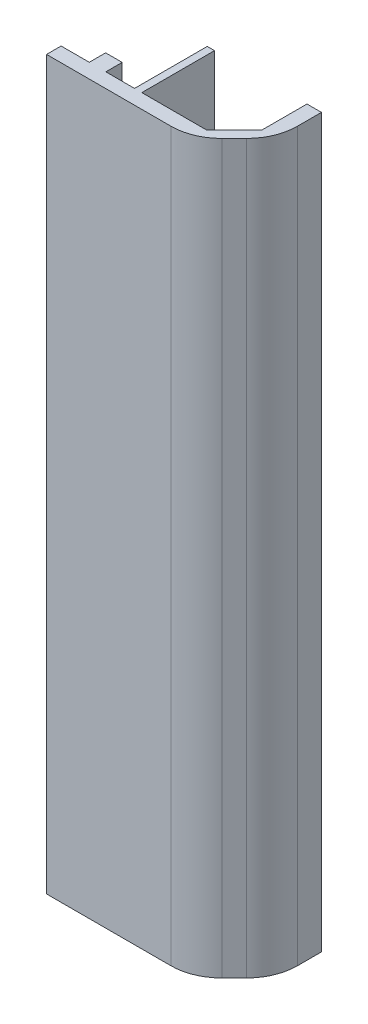
ISO-10303-21;
HEADER;
FILE_DESCRIPTION(('STEP AP214'),'2;1');
FILE_NAME('part.step','',(''),(''),'','','');
FILE_SCHEMA(('AUTOMOTIVE_DESIGN { 1 0 10303 214 1 1 1 1 }'));
ENDSEC;
DATA;
#1=APPLICATION_CONTEXT('core data for automotive mechanical design processes');
#2=APPLICATION_PROTOCOL_DEFINITION('international standard','automotive_design',2000,#1);
#3=PRODUCT_CONTEXT('',#1,'mechanical');
#4=PRODUCT('Part','Part','',(#3));
#5=PRODUCT_RELATED_PRODUCT_CATEGORY('part','',(#4));
#6=PRODUCT_DEFINITION_FORMATION('','',#4);
#7=PRODUCT_DEFINITION_CONTEXT('part definition',#1,'design');
#8=PRODUCT_DEFINITION('design','',#6,#7);
#9=PRODUCT_DEFINITION_SHAPE('','',#8);
#10=(LENGTH_UNIT() NAMED_UNIT(*) SI_UNIT(.MILLI.,.METRE.));
#11=(NAMED_UNIT(*) PLANE_ANGLE_UNIT() SI_UNIT($,.RADIAN.));
#12=(NAMED_UNIT(*) SI_UNIT($,.STERADIAN.) SOLID_ANGLE_UNIT());
#13=UNCERTAINTY_MEASURE_WITH_UNIT(LENGTH_MEASURE(1.E-05),#10,'distance_accuracy_value','');
#14=(GEOMETRIC_REPRESENTATION_CONTEXT(3) GLOBAL_UNCERTAINTY_ASSIGNED_CONTEXT((#13)) GLOBAL_UNIT_ASSIGNED_CONTEXT((#10,
#11,#12)) REPRESENTATION_CONTEXT('',''));
#15=CARTESIAN_POINT('',(0.,0.,0.));
#16=DIRECTION('',(0.,0.,1.));
#17=DIRECTION('',(1.,0.,0.));
#18=AXIS2_PLACEMENT_3D('',#15,#16,#17);
#19=CARTESIAN_POINT('',(-22.9517231924407,200.,-2.35925925925926));
#20=DIRECTION('',(0.,0.,1.));
#21=DIRECTION('',(1.,0.,0.));
#22=AXIS2_PLACEMENT_3D('',#19,#20,#21);
#23=PLANE('',#22);
#24=DIRECTION('',(0.,-1.,0.));
#25=VECTOR('',#24,1.);
#26=CARTESIAN_POINT('',(-13.0517231924407,200.,-2.35925925925926));
#27=LINE('',#26,#25);
#28=CARTESIAN_POINT('',(-13.0517231924407,200.,-2.35925925925926));
#29=VERTEX_POINT('',#28);
#30=CARTESIAN_POINT('',(-13.0517231924407,0.,-2.35925925925926));
#31=VERTEX_POINT('',#30);
#32=EDGE_CURVE('E61',#29,#31,#27,.T.);
#33=ORIENTED_EDGE('',*,*,#32,.F.);
#34=DIRECTION('',(-1.,0.,0.));
#35=VECTOR('',#34,1.);
#36=CARTESIAN_POINT('',(-22.9517231924407,200.,-2.35925925925926));
#37=LINE('',#36,#35);
#38=CARTESIAN_POINT('',(4.79827680755932,200.,-2.35925925925926));
#39=VERTEX_POINT('',#38);
#40=EDGE_CURVE('E234',#39,#29,#37,.T.);
#41=ORIENTED_EDGE('',*,*,#40,.F.);
#42=DIRECTION('',(0.,-1.,0.));
#43=VECTOR('',#42,1.);
#44=CARTESIAN_POINT('',(4.79827680755932,200.,-2.35925925925926));
#45=LINE('',#44,#43);
#46=CARTESIAN_POINT('',(4.79827680755932,0.,-2.35925925925926));
#47=VERTEX_POINT('',#46);
#48=EDGE_CURVE('E289',#39,#47,#45,.T.);
#49=ORIENTED_EDGE('',*,*,#48,.T.);
#50=DIRECTION('',(-1.,0.,0.));
#51=VECTOR('',#50,1.);
#52=CARTESIAN_POINT('',(-22.9517231924407,0.,-2.35925925925926));
#53=LINE('',#52,#51);
#54=EDGE_CURVE('E270',#47,#31,#53,.T.);
#55=ORIENTED_EDGE('',*,*,#54,.T.);
#56=EDGE_LOOP('',(#33,#41,#49,#55));
#57=FACE_BOUND('',#56,.T.);
#58=ADVANCED_FACE('F37',(#57),#23,.F.);
#59=DIRECTION('',(0.,1.,0.));
#60=VECTOR('',#59,1.);
#61=CARTESIAN_POINT('',(-15.0517231924407,200.,-2.35925925925926));
#62=LINE('',#61,#60);
#63=CARTESIAN_POINT('',(-15.0517231924407,0.,-2.35925925925926));
#64=VERTEX_POINT('',#63);
#65=CARTESIAN_POINT('',(-15.0517231924407,200.,-2.35925925925926));
#66=VERTEX_POINT('',#65);
#67=EDGE_CURVE('E188',#64,#66,#62,.T.);
#68=ORIENTED_EDGE('',*,*,#67,.F.);
#69=CARTESIAN_POINT('',(-22.9517231924407,0.,-2.35925925925926));
#70=VERTEX_POINT('',#69);
#71=EDGE_CURVE('E269',#64,#70,#53,.T.);
#72=ORIENTED_EDGE('',*,*,#71,.T.);
#73=DIRECTION('',(0.,-1.,0.));
#74=VECTOR('',#73,1.);
#75=CARTESIAN_POINT('',(-22.9517231924407,200.,-2.35925925925926));
#76=LINE('',#75,#74);
#77=CARTESIAN_POINT('',(-22.9517231924407,200.,-2.35925925925926));
#78=VERTEX_POINT('',#77);
#79=EDGE_CURVE('E285',#78,#70,#76,.T.);
#80=ORIENTED_EDGE('',*,*,#79,.F.);
#81=EDGE_CURVE('E53',#66,#78,#37,.T.);
#82=ORIENTED_EDGE('',*,*,#81,.F.);
#83=EDGE_LOOP('',(#68,#72,#80,#82));
#84=FACE_BOUND('',#83,.T.);
#85=ADVANCED_FACE('F375',(#84),#23,.F.);
#86=CARTESIAN_POINT('',(-27.5017231924407,200.,-6.85925925925926));
#87=DIRECTION('',(1.,0.,0.));
#88=DIRECTION('',(0.,0.,-1.));
#89=AXIS2_PLACEMENT_3D('',#86,#87,#88);
#90=PLANE('',#89);
#91=DIRECTION('',(0.,0.,1.));
#92=VECTOR('',#91,1.);
#93=CARTESIAN_POINT('',(-27.5017231924407,0.,-6.85925925925926));
#94=LINE('',#93,#92);
#95=CARTESIAN_POINT('',(-27.5017231924407,0.,-6.85925925925926));
#96=VERTEX_POINT('',#95);
#97=CARTESIAN_POINT('',(-27.5017231924407,0.,-2.35925925925926));
#98=VERTEX_POINT('',#97);
#99=EDGE_CURVE('E192',#96,#98,#94,.T.);
#100=ORIENTED_EDGE('',*,*,#99,.T.);
#101=DIRECTION('',(0.,-1.,0.));
#102=VECTOR('',#101,1.);
#103=CARTESIAN_POINT('',(-27.5017231924407,200.,-2.35925925925926));
#104=LINE('',#103,#102);
#105=CARTESIAN_POINT('',(-27.5017231924407,200.,-2.35925925925926));
#106=VERTEX_POINT('',#105);
#107=EDGE_CURVE('E313',#106,#98,#104,.T.);
#108=ORIENTED_EDGE('',*,*,#107,.F.);
#109=DIRECTION('',(0.,0.,1.));
#110=VECTOR('',#109,1.);
#111=CARTESIAN_POINT('',(-27.5017231924407,200.,-6.85925925925926));
#112=LINE('',#111,#110);
#113=CARTESIAN_POINT('',(-27.5017231924407,200.,-6.85925925925926));
#114=VERTEX_POINT('',#113);
#115=EDGE_CURVE('E203',#114,#106,#112,.T.);
#116=ORIENTED_EDGE('',*,*,#115,.F.);
#117=DIRECTION('',(0.,-1.,0.));
#118=VECTOR('',#117,1.);
#119=CARTESIAN_POINT('',(-27.5017231924407,200.,-6.85925925925926));
#120=LINE('',#119,#118);
#121=EDGE_CURVE('E242',#114,#96,#120,.T.);
#122=ORIENTED_EDGE('',*,*,#121,.T.);
#123=EDGE_LOOP('',(#100,#108,#116,#122));
#124=FACE_BOUND('',#123,.T.);
#125=ADVANCED_FACE('F365',(#124),#90,.F.);
#126=CARTESIAN_POINT('',(-27.5017231924407,200.,-2.35925925925926));
#127=DIRECTION('',(0.,0.,1.));
#128=DIRECTION('',(1.,0.,0.));
#129=AXIS2_PLACEMENT_3D('',#126,#127,#128);
#130=PLANE('',#129);
#131=DIRECTION('',(-1.,0.,0.));
#132=VECTOR('',#131,1.);
#133=CARTESIAN_POINT('',(-27.5017231924407,0.,-2.35925925925926));
#134=LINE('',#133,#132);
#135=CARTESIAN_POINT('',(-35.2517231924407,0.,-2.35925925925926));
#136=VERTEX_POINT('',#135);
#137=EDGE_CURVE('E197',#98,#136,#134,.T.);
#138=ORIENTED_EDGE('',*,*,#137,.T.);
#139=DIRECTION('',(0.,-1.,0.));
#140=VECTOR('',#139,1.);
#141=CARTESIAN_POINT('',(-35.2517231924407,200.,-2.35925925925926));
#142=LINE('',#141,#140);
#143=CARTESIAN_POINT('',(-35.2517231924407,200.,-2.35925925925926));
#144=VERTEX_POINT('',#143);
#145=EDGE_CURVE('E309',#144,#136,#142,.T.);
#146=ORIENTED_EDGE('',*,*,#145,.F.);
#147=DIRECTION('',(-1.,0.,0.));
#148=VECTOR('',#147,1.);
#149=CARTESIAN_POINT('',(-27.5017231924407,200.,-2.35925925925926));
#150=LINE('',#149,#148);
#151=EDGE_CURVE('E207',#106,#144,#150,.T.);
#152=ORIENTED_EDGE('',*,*,#151,.F.);
#153=ORIENTED_EDGE('',*,*,#107,.T.);
#154=EDGE_LOOP('',(#138,#146,#152,#153));
#155=FACE_BOUND('',#154,.T.);
#156=ADVANCED_FACE('F362',(#155),#130,.F.);
#157=CARTESIAN_POINT('',(-35.2517231924407,200.,-2.35925925925926));
#158=DIRECTION('',(1.,0.,0.));
#159=DIRECTION('',(0.,0.,-1.));
#160=AXIS2_PLACEMENT_3D('',#157,#158,#159);
#161=PLANE('',#160);
#162=DIRECTION('',(0.,0.,1.));
#163=VECTOR('',#162,1.);
#164=CARTESIAN_POINT('',(-35.2517231924407,0.,-2.35925925925926));
#165=LINE('',#164,#163);
#166=CARTESIAN_POINT('',(-35.2517231924407,0.,1.64074074074074));
#167=VERTEX_POINT('',#166);
#168=EDGE_CURVE('E246',#136,#167,#165,.T.);
#169=ORIENTED_EDGE('',*,*,#168,.T.);
#170=DIRECTION('',(0.,-1.,0.));
#171=VECTOR('',#170,1.);
#172=CARTESIAN_POINT('',(-35.2517231924407,200.,1.64074074074074));
#173=LINE('',#172,#171);
#174=CARTESIAN_POINT('',(-35.2517231924407,200.,1.64074074074074));
#175=VERTEX_POINT('',#174);
#176=EDGE_CURVE('E305',#175,#167,#173,.T.);
#177=ORIENTED_EDGE('',*,*,#176,.F.);
#178=DIRECTION('',(0.,0.,1.));
#179=VECTOR('',#178,1.);
#180=CARTESIAN_POINT('',(-35.2517231924407,200.,-2.35925925925926));
#181=LINE('',#180,#179);
#182=EDGE_CURVE('E211',#144,#175,#181,.T.);
#183=ORIENTED_EDGE('',*,*,#182,.F.);
#184=ORIENTED_EDGE('',*,*,#145,.T.);
#185=EDGE_LOOP('',(#169,#177,#183,#184));
#186=FACE_BOUND('',#185,.T.);
#187=ADVANCED_FACE('F356',(#186),#161,.F.);
#188=CARTESIAN_POINT('',(-35.2517231924407,200.,1.64074074074074));
#189=DIRECTION('',(0.,0.,-1.));
#190=DIRECTION('',(-1.,0.,0.));
#191=AXIS2_PLACEMENT_3D('',#188,#189,#190);
#192=PLANE('',#191);
#193=DIRECTION('',(1.,0.,0.));
#194=VECTOR('',#193,1.);
#195=CARTESIAN_POINT('',(-35.2517231924407,0.,1.64074074074074));
#196=LINE('',#195,#194);
#197=CARTESIAN_POINT('',(-1.02071306566402,0.,1.64074074074074));
#198=VERTEX_POINT('',#197);
#199=EDGE_CURVE('E249',#167,#198,#196,.T.);
#200=ORIENTED_EDGE('',*,*,#199,.T.);
#201=DIRECTION('',(0.,-1.,0.));
#202=VECTOR('',#201,1.);
#203=CARTESIAN_POINT('',(-1.02071306566402,200.,1.64074074074074));
#204=LINE('',#203,#202);
#205=CARTESIAN_POINT('',(-1.02071306566402,200.,1.64074074074074));
#206=VERTEX_POINT('',#205);
#207=EDGE_CURVE('E330',#198,#206,#204,.F.);
#208=ORIENTED_EDGE('',*,*,#207,.T.);
#209=DIRECTION('',(1.,0.,0.));
#210=VECTOR('',#209,1.);
#211=CARTESIAN_POINT('',(-35.2517231924407,200.,1.64074074074074));
#212=LINE('',#211,#210);
#213=EDGE_CURVE('E214',#175,#206,#212,.T.);
#214=ORIENTED_EDGE('',*,*,#213,.F.);
#215=ORIENTED_EDGE('',*,*,#176,.T.);
#216=EDGE_LOOP('',(#200,#208,#214,#215));
#217=FACE_BOUND('',#216,.T.);
#218=ADVANCED_FACE('F352',(#217),#192,.F.);
#219=CARTESIAN_POINT('',(4.77827680755932,200.,1.64074074074074));
#220=DIRECTION('',(-0.707106781186547,0.,-0.707106781186548));
#221=DIRECTION('',(-0.707106781186548,0.,0.707106781186547));
#222=AXIS2_PLACEMENT_3D('',#219,#220,#221);
#223=PLANE('',#222);
#224=DIRECTION('',(0.707106781186548,0.,-0.707106781186547));
#225=VECTOR('',#224,1.);
#226=CARTESIAN_POINT('',(4.77827680755932,200.,1.64074074074074));
#227=LINE('',#226,#225);
#228=CARTESIAN_POINT('',(8.87878187094765,200.,-2.45976432264759));
#229=VERTEX_POINT('',#228);
#230=CARTESIAN_POINT('',(12.2611050775043,200.,-5.84208752920422));
#231=VERTEX_POINT('',#230);
#232=EDGE_CURVE('E218',#229,#231,#227,.T.);
#233=ORIENTED_EDGE('',*,*,#232,.F.);
#234=DIRECTION('',(0.,-1.,0.));
#235=VECTOR('',#234,1.);
#236=CARTESIAN_POINT('',(8.87878187094765,200.,-2.45976432264759));
#237=LINE('',#236,#235);
#238=CARTESIAN_POINT('',(8.87878187094765,0.,-2.45976432264759));
#239=VERTEX_POINT('',#238);
#240=EDGE_CURVE('E320',#229,#239,#237,.T.);
#241=ORIENTED_EDGE('',*,*,#240,.T.);
#242=DIRECTION('',(0.707106781186548,0.,-0.707106781186547));
#243=VECTOR('',#242,1.);
#244=CARTESIAN_POINT('',(4.77827680755932,0.,1.64074074074074));
#245=LINE('',#244,#243);
#246=CARTESIAN_POINT('',(12.2611050775043,0.,-5.84208752920422));
#247=VERTEX_POINT('',#246);
#248=EDGE_CURVE('E253',#239,#247,#245,.T.);
#249=ORIENTED_EDGE('',*,*,#248,.T.);
#250=DIRECTION('',(0.,-1.,0.));
#251=VECTOR('',#250,1.);
#252=CARTESIAN_POINT('',(12.2611050775043,200.,-5.84208752920422));
#253=LINE('',#252,#251);
#254=EDGE_CURVE('E317',#247,#231,#253,.F.);
#255=ORIENTED_EDGE('',*,*,#254,.T.);
#256=EDGE_LOOP('',(#233,#241,#249,#255));
#257=FACE_BOUND('',#256,.T.);
#258=ADVANCED_FACE('F346',(#257),#223,.F.);
#259=CARTESIAN_POINT('',(16.3616101408926,200.,-22.3592592592593));
#260=DIRECTION('',(-1.,0.,0.));
#261=DIRECTION('',(0.,0.,1.));
#262=AXIS2_PLACEMENT_3D('',#259,#260,#261);
#263=PLANE('',#262);
#264=DIRECTION('',(0.,0.,-1.));
#265=VECTOR('',#264,1.);
#266=CARTESIAN_POINT('',(16.3616101408926,200.,-22.3592592592593));
#267=LINE('',#266,#265);
#268=CARTESIAN_POINT('',(16.3616101408926,200.,-15.7415824658159));
#269=VERTEX_POINT('',#268);
#270=CARTESIAN_POINT('',(16.3616101408926,200.,-22.3592592592593));
#271=VERTEX_POINT('',#270);
#272=EDGE_CURVE('E222',#269,#271,#267,.T.);
#273=ORIENTED_EDGE('',*,*,#272,.F.);
#274=DIRECTION('',(0.,-1.,0.));
#275=VECTOR('',#274,1.);
#276=CARTESIAN_POINT('',(16.3616101408926,200.,-15.7415824658159));
#277=LINE('',#276,#275);
#278=CARTESIAN_POINT('',(16.3616101408926,0.,-15.7415824658159));
#279=VERTEX_POINT('',#278);
#280=EDGE_CURVE('E11',#269,#279,#277,.T.);
#281=ORIENTED_EDGE('',*,*,#280,.T.);
#282=DIRECTION('',(0.,0.,-1.));
#283=VECTOR('',#282,1.);
#284=CARTESIAN_POINT('',(16.3616101408926,0.,-22.3592592592593));
#285=LINE('',#284,#283);
#286=CARTESIAN_POINT('',(16.3616101408926,0.,-22.3592592592593));
#287=VERTEX_POINT('',#286);
#288=EDGE_CURVE('E257',#279,#287,#285,.T.);
#289=ORIENTED_EDGE('',*,*,#288,.T.);
#290=DIRECTION('',(0.,-1.,0.));
#291=VECTOR('',#290,1.);
#292=CARTESIAN_POINT('',(16.3616101408926,200.,-22.3592592592593));
#293=LINE('',#292,#291);
#294=EDGE_CURVE('E301',#271,#287,#293,.T.);
#295=ORIENTED_EDGE('',*,*,#294,.F.);
#296=EDGE_LOOP('',(#273,#281,#289,#295));
#297=FACE_BOUND('',#296,.T.);
#298=ADVANCED_FACE('F421',(#297),#263,.F.);
#299=CARTESIAN_POINT('',(12.3816101408926,200.,-22.3592592592593));
#300=DIRECTION('',(0.,0.,1.));
#301=DIRECTION('',(1.,0.,0.));
#302=AXIS2_PLACEMENT_3D('',#299,#300,#301);
#303=PLANE('',#302);
#304=DIRECTION('',(-1.,0.,0.));
#305=VECTOR('',#304,1.);
#306=CARTESIAN_POINT('',(12.3816101408926,0.,-22.3592592592593));
#307=LINE('',#306,#305);
#308=CARTESIAN_POINT('',(12.3816101408926,0.,-22.3592592592593));
#309=VERTEX_POINT('',#308);
#310=EDGE_CURVE('E260',#287,#309,#307,.T.);
#311=ORIENTED_EDGE('',*,*,#310,.T.);
#312=DIRECTION('',(0.,-1.,0.));
#313=VECTOR('',#312,1.);
#314=CARTESIAN_POINT('',(12.3816101408926,200.,-22.3592592592593));
#315=LINE('',#314,#313);
#316=CARTESIAN_POINT('',(12.3816101408926,200.,-22.3592592592593));
#317=VERTEX_POINT('',#316);
#318=EDGE_CURVE('E297',#317,#309,#315,.T.);
#319=ORIENTED_EDGE('',*,*,#318,.F.);
#320=DIRECTION('',(-1.,0.,0.));
#321=VECTOR('',#320,1.);
#322=CARTESIAN_POINT('',(12.3816101408926,200.,-22.3592592592593));
#323=LINE('',#322,#321);
#324=EDGE_CURVE('E225',#271,#317,#323,.T.);
#325=ORIENTED_EDGE('',*,*,#324,.F.);
#326=ORIENTED_EDGE('',*,*,#294,.T.);
#327=EDGE_LOOP('',(#311,#319,#325,#326));
#328=FACE_BOUND('',#327,.T.);
#329=ADVANCED_FACE('F417',(#328),#303,.F.);
#330=CARTESIAN_POINT('',(12.3816101408926,200.,-9.94259259259255));
#331=DIRECTION('',(1.,0.,0.));
#332=DIRECTION('',(0.,0.,-1.));
#333=AXIS2_PLACEMENT_3D('',#330,#331,#332);
#334=PLANE('',#333);
#335=DIRECTION('',(0.,0.,1.));
#336=VECTOR('',#335,1.);
#337=CARTESIAN_POINT('',(12.3816101408926,0.,-9.94259259259255));
#338=LINE('',#337,#336);
#339=CARTESIAN_POINT('',(12.3816101408926,0.,-9.94259259259255));
#340=VERTEX_POINT('',#339);
#341=EDGE_CURVE('E263',#309,#340,#338,.T.);
#342=ORIENTED_EDGE('',*,*,#341,.T.);
#343=DIRECTION('',(0.,-1.,0.));
#344=VECTOR('',#343,1.);
#345=CARTESIAN_POINT('',(12.3816101408926,200.,-9.94259259259255));
#346=LINE('',#345,#344);
#347=CARTESIAN_POINT('',(12.3816101408926,200.,-9.94259259259255));
#348=VERTEX_POINT('',#347);
#349=EDGE_CURVE('E293',#348,#340,#346,.T.);
#350=ORIENTED_EDGE('',*,*,#349,.F.);
#351=DIRECTION('',(0.,0.,1.));
#352=VECTOR('',#351,1.);
#353=CARTESIAN_POINT('',(12.3816101408926,200.,-9.94259259259255));
#354=LINE('',#353,#352);
#355=EDGE_CURVE('E228',#317,#348,#354,.T.);
#356=ORIENTED_EDGE('',*,*,#355,.F.);
#357=ORIENTED_EDGE('',*,*,#318,.T.);
#358=EDGE_LOOP('',(#342,#350,#356,#357));
#359=FACE_BOUND('',#358,.T.);
#360=ADVANCED_FACE('F413',(#359),#334,.F.);
#361=CARTESIAN_POINT('',(4.79827680755932,200.,-2.35925925925926));
#362=DIRECTION('',(0.707106781186548,0.,0.707106781186547));
#363=DIRECTION('',(0.707106781186547,0.,-0.707106781186548));
#364=AXIS2_PLACEMENT_3D('',#361,#362,#363);
#365=PLANE('',#364);
#366=DIRECTION('',(-0.707106781186547,0.,0.707106781186548));
#367=VECTOR('',#366,1.);
#368=CARTESIAN_POINT('',(4.79827680755932,0.,-2.35925925925926));
#369=LINE('',#368,#367);
#370=EDGE_CURVE('E266',#340,#47,#369,.T.);
#371=ORIENTED_EDGE('',*,*,#370,.T.);
#372=ORIENTED_EDGE('',*,*,#48,.F.);
#373=DIRECTION('',(-0.707106781186547,0.,0.707106781186548));
#374=VECTOR('',#373,1.);
#375=CARTESIAN_POINT('',(4.79827680755932,200.,-2.35925925925926));
#376=LINE('',#375,#374);
#377=EDGE_CURVE('E231',#348,#39,#376,.T.);
#378=ORIENTED_EDGE('',*,*,#377,.F.);
#379=ORIENTED_EDGE('',*,*,#349,.T.);
#380=EDGE_LOOP('',(#371,#372,#378,#379));
#381=FACE_BOUND('',#380,.T.);
#382=ADVANCED_FACE('F410',(#381),#365,.F.);
#383=CARTESIAN_POINT('',(-22.9517231924407,200.,-6.85925925925926));
#384=DIRECTION('',(-1.,0.,0.));
#385=DIRECTION('',(0.,0.,1.));
#386=AXIS2_PLACEMENT_3D('',#383,#384,#385);
#387=PLANE('',#386);
#388=DIRECTION('',(0.,0.,-1.));
#389=VECTOR('',#388,1.);
#390=CARTESIAN_POINT('',(-22.9517231924407,0.,-6.85925925925926));
#391=LINE('',#390,#389);
#392=CARTESIAN_POINT('',(-22.9517231924407,0.,-6.85925925925926));
#393=VERTEX_POINT('',#392);
#394=EDGE_CURVE('E273',#70,#393,#391,.T.);
#395=ORIENTED_EDGE('',*,*,#394,.T.);
#396=DIRECTION('',(0.,-1.,0.));
#397=VECTOR('',#396,1.);
#398=CARTESIAN_POINT('',(-22.9517231924407,200.,-6.85925925925926));
#399=LINE('',#398,#397);
#400=CARTESIAN_POINT('',(-22.9517231924407,200.,-6.85925925925926));
#401=VERTEX_POINT('',#400);
#402=EDGE_CURVE('E281',#401,#393,#399,.T.);
#403=ORIENTED_EDGE('',*,*,#402,.F.);
#404=DIRECTION('',(0.,0.,-1.));
#405=VECTOR('',#404,1.);
#406=CARTESIAN_POINT('',(-22.9517231924407,200.,-6.85925925925926));
#407=LINE('',#406,#405);
#408=EDGE_CURVE('E237',#78,#401,#407,.T.);
#409=ORIENTED_EDGE('',*,*,#408,.F.);
#410=ORIENTED_EDGE('',*,*,#79,.T.);
#411=EDGE_LOOP('',(#395,#403,#409,#410));
#412=FACE_BOUND('',#411,.T.);
#413=ADVANCED_FACE('F373',(#412),#387,.F.);
#414=CARTESIAN_POINT('',(-27.5017231924407,200.,-6.85925925925926));
#415=DIRECTION('',(0.,0.,1.));
#416=DIRECTION('',(1.,0.,0.));
#417=AXIS2_PLACEMENT_3D('',#414,#415,#416);
#418=PLANE('',#417);
#419=DIRECTION('',(-1.,0.,0.));
#420=VECTOR('',#419,1.);
#421=CARTESIAN_POINT('',(-27.5017231924407,0.,-6.85925925925926));
#422=LINE('',#421,#420);
#423=EDGE_CURVE('E208',#393,#96,#422,.T.);
#424=ORIENTED_EDGE('',*,*,#423,.T.);
#425=ORIENTED_EDGE('',*,*,#121,.F.);
#426=DIRECTION('',(-1.,0.,0.));
#427=VECTOR('',#426,1.);
#428=CARTESIAN_POINT('',(-27.5017231924407,200.,-6.85925925925926));
#429=LINE('',#428,#427);
#430=EDGE_CURVE('E240',#401,#114,#429,.T.);
#431=ORIENTED_EDGE('',*,*,#430,.F.);
#432=ORIENTED_EDGE('',*,*,#402,.T.);
#433=EDGE_LOOP('',(#424,#425,#431,#432));
#434=FACE_BOUND('',#433,.T.);
#435=ADVANCED_FACE('F369',(#434),#418,.F.);
#436=CARTESIAN_POINT('',(0.,200.,0.));
#437=DIRECTION('',(0.,-1.,0.));
#438=DIRECTION('',(0.,0.,-1.));
#439=AXIS2_PLACEMENT_3D('',#436,#437,#438);
#440=PLANE('',#439);
#441=ORIENTED_EDGE('',*,*,#213,.T.);
#442=CARTESIAN_POINT('',(-1.02071306566402,200.,-12.3592592592593));
#443=DIRECTION('',(0.,-1.,0.));
#444=DIRECTION('',(0.,0.,-1.));
#445=AXIS2_PLACEMENT_3D('',#442,#443,#444);
#446=CIRCLE('',#445,14.);
#447=EDGE_CURVE('E46',#206,#229,#446,.F.);
#448=ORIENTED_EDGE('',*,*,#447,.T.);
#449=ORIENTED_EDGE('',*,*,#232,.T.);
#450=CARTESIAN_POINT('',(2.36161014089262,200.,-15.7415824658159));
#451=DIRECTION('',(0.,-1.,0.));
#452=DIRECTION('',(0.,0.,-1.));
#453=AXIS2_PLACEMENT_3D('',#450,#451,#452);
#454=CIRCLE('',#453,14.);
#455=EDGE_CURVE('E333',#231,#269,#454,.F.);
#456=ORIENTED_EDGE('',*,*,#455,.T.);
#457=ORIENTED_EDGE('',*,*,#272,.T.);
#458=ORIENTED_EDGE('',*,*,#324,.T.);
#459=ORIENTED_EDGE('',*,*,#355,.T.);
#460=ORIENTED_EDGE('',*,*,#377,.T.);
#461=ORIENTED_EDGE('',*,*,#40,.T.);
#462=DIRECTION('',(0.,0.,1.));
#463=VECTOR('',#462,1.);
#464=CARTESIAN_POINT('',(-13.0517231924407,200.,-22.3592592592593));
#465=LINE('',#464,#463);
#466=CARTESIAN_POINT('',(-13.0517231924407,200.,-22.3592592592593));
#467=VERTEX_POINT('',#466);
#468=EDGE_CURVE('E382',#467,#29,#465,.T.);
#469=ORIENTED_EDGE('',*,*,#468,.F.);
#470=DIRECTION('',(1.,0.,0.));
#471=VECTOR('',#470,1.);
#472=CARTESIAN_POINT('',(-13.0517231924407,200.,-22.3592592592593));
#473=LINE('',#472,#471);
#474=CARTESIAN_POINT('',(-15.0517231924407,200.,-22.3592592592593));
#475=VERTEX_POINT('',#474);
#476=EDGE_CURVE('E183',#475,#467,#473,.T.);
#477=ORIENTED_EDGE('',*,*,#476,.F.);
#478=DIRECTION('',(0.,0.,1.));
#479=VECTOR('',#478,1.);
#480=CARTESIAN_POINT('',(-15.0517231924407,200.,-22.3592592592593));
#481=LINE('',#480,#479);
#482=EDGE_CURVE('E199',#475,#66,#481,.T.);
#483=ORIENTED_EDGE('',*,*,#482,.T.);
#484=ORIENTED_EDGE('',*,*,#81,.T.);
#485=ORIENTED_EDGE('',*,*,#408,.T.);
#486=ORIENTED_EDGE('',*,*,#430,.T.);
#487=ORIENTED_EDGE('',*,*,#115,.T.);
#488=ORIENTED_EDGE('',*,*,#151,.T.);
#489=ORIENTED_EDGE('',*,*,#182,.T.);
#490=EDGE_LOOP('',(#441,#448,#449,#456,#457,#458,#459,#460,#461,#469,#477,#483,#484,#485,#486,
#487,#488,#489));
#491=FACE_BOUND('',#490,.T.);
#492=ADVANCED_FACE('F339',(#491),#440,.F.);
#493=CARTESIAN_POINT('',(0.,0.,0.));
#494=DIRECTION('',(0.,-1.,0.));
#495=DIRECTION('',(0.,0.,-1.));
#496=AXIS2_PLACEMENT_3D('',#493,#494,#495);
#497=PLANE('',#496);
#498=ORIENTED_EDGE('',*,*,#248,.F.);
#499=CARTESIAN_POINT('',(-1.02071306566402,0.,-12.3592592592593));
#500=DIRECTION('',(0.,-1.,0.));
#501=DIRECTION('',(0.,0.,-1.));
#502=AXIS2_PLACEMENT_3D('',#499,#500,#501);
#503=CIRCLE('',#502,14.);
#504=EDGE_CURVE('E327',#239,#198,#503,.T.);
#505=ORIENTED_EDGE('',*,*,#504,.T.);
#506=ORIENTED_EDGE('',*,*,#199,.F.);
#507=ORIENTED_EDGE('',*,*,#168,.F.);
#508=ORIENTED_EDGE('',*,*,#137,.F.);
#509=ORIENTED_EDGE('',*,*,#99,.F.);
#510=ORIENTED_EDGE('',*,*,#423,.F.);
#511=ORIENTED_EDGE('',*,*,#394,.F.);
#512=ORIENTED_EDGE('',*,*,#71,.F.);
#513=DIRECTION('',(0.,0.,1.));
#514=VECTOR('',#513,1.);
#515=CARTESIAN_POINT('',(-15.0517231924407,0.,-22.3592592592593));
#516=LINE('',#515,#514);
#517=CARTESIAN_POINT('',(-15.0517231924407,0.,-22.3592592592593));
#518=VERTEX_POINT('',#517);
#519=EDGE_CURVE('E173',#518,#64,#516,.T.);
#520=ORIENTED_EDGE('',*,*,#519,.F.);
#521=DIRECTION('',(-1.,0.,0.));
#522=VECTOR('',#521,1.);
#523=CARTESIAN_POINT('',(-13.0517231924407,0.,-22.3592592592593));
#524=LINE('',#523,#522);
#525=CARTESIAN_POINT('',(-13.0517231924407,0.,-22.3592592592593));
#526=VERTEX_POINT('',#525);
#527=EDGE_CURVE('E165',#526,#518,#524,.T.);
#528=ORIENTED_EDGE('',*,*,#527,.F.);
#529=DIRECTION('',(0.,0.,1.));
#530=VECTOR('',#529,1.);
#531=CARTESIAN_POINT('',(-13.0517231924407,0.,-22.3592592592593));
#532=LINE('',#531,#530);
#533=EDGE_CURVE('E171',#526,#31,#532,.T.);
#534=ORIENTED_EDGE('',*,*,#533,.T.);
#535=ORIENTED_EDGE('',*,*,#54,.F.);
#536=ORIENTED_EDGE('',*,*,#370,.F.);
#537=ORIENTED_EDGE('',*,*,#341,.F.);
#538=ORIENTED_EDGE('',*,*,#310,.F.);
#539=ORIENTED_EDGE('',*,*,#288,.F.);
#540=CARTESIAN_POINT('',(2.36161014089262,0.,-15.7415824658159));
#541=DIRECTION('',(0.,-1.,0.));
#542=DIRECTION('',(0.,0.,-1.));
#543=AXIS2_PLACEMENT_3D('',#540,#541,#542);
#544=CIRCLE('',#543,14.);
#545=EDGE_CURVE('E324',#279,#247,#544,.T.);
#546=ORIENTED_EDGE('',*,*,#545,.T.);
#547=EDGE_LOOP('',(#498,#505,#506,#507,#508,#509,#510,#511,#512,#520,#528,#534,#535,#536,#537,
#538,#539,#546));
#548=FACE_BOUND('',#547,.T.);
#549=ADVANCED_FACE('F168',(#548),#497,.T.);
#550=CARTESIAN_POINT('',(-1.02071306566402,200.,-12.3592592592593));
#551=DIRECTION('',(0.,-1.,0.));
#552=DIRECTION('',(0.,0.,-1.));
#553=AXIS2_PLACEMENT_3D('',#550,#551,#552);
#554=CYLINDRICAL_SURFACE('',#553,14.);
#555=ORIENTED_EDGE('',*,*,#447,.F.);
#556=ORIENTED_EDGE('',*,*,#207,.F.);
#557=ORIENTED_EDGE('',*,*,#504,.F.);
#558=ORIENTED_EDGE('',*,*,#240,.F.);
#559=EDGE_LOOP('',(#555,#556,#557,#558));
#560=FACE_BOUND('',#559,.T.);
#561=ADVANCED_FACE('F348',(#560),#554,.T.);
#562=CARTESIAN_POINT('',(2.36161014089262,200.,-15.7415824658159));
#563=DIRECTION('',(0.,-1.,0.));
#564=DIRECTION('',(0.,0.,-1.));
#565=AXIS2_PLACEMENT_3D('',#562,#563,#564);
#566=CYLINDRICAL_SURFACE('',#565,14.);
#567=ORIENTED_EDGE('',*,*,#455,.F.);
#568=ORIENTED_EDGE('',*,*,#254,.F.);
#569=ORIENTED_EDGE('',*,*,#545,.F.);
#570=ORIENTED_EDGE('',*,*,#280,.F.);
#571=EDGE_LOOP('',(#567,#568,#569,#570));
#572=FACE_BOUND('',#571,.T.);
#573=ADVANCED_FACE('F39',(#572),#566,.T.);
#574=CARTESIAN_POINT('',(-13.0517231924407,200.,-22.3592592592593));
#575=DIRECTION('',(-1.,0.,0.));
#576=DIRECTION('',(0.,-1.,0.));
#577=AXIS2_PLACEMENT_3D('',#574,#575,#576);
#578=PLANE('',#577);
#579=ORIENTED_EDGE('',*,*,#32,.T.);
#580=ORIENTED_EDGE('',*,*,#533,.F.);
#581=DIRECTION('',(0.,-1.,0.));
#582=VECTOR('',#581,1.);
#583=CARTESIAN_POINT('',(-13.0517231924407,200.,-22.3592592592593));
#584=LINE('',#583,#582);
#585=EDGE_CURVE('E178',#467,#526,#584,.T.);
#586=ORIENTED_EDGE('',*,*,#585,.F.);
#587=ORIENTED_EDGE('',*,*,#468,.T.);
#588=EDGE_LOOP('',(#579,#580,#586,#587));
#589=FACE_BOUND('',#588,.T.);
#590=ADVANCED_FACE('F190',(#589),#578,.F.);
#591=CARTESIAN_POINT('',(-15.0517231924407,200.,-22.3592592592593));
#592=DIRECTION('',(1.,0.,0.));
#593=DIRECTION('',(0.,1.,0.));
#594=AXIS2_PLACEMENT_3D('',#591,#592,#593);
#595=PLANE('',#594);
#596=ORIENTED_EDGE('',*,*,#67,.T.);
#597=ORIENTED_EDGE('',*,*,#482,.F.);
#598=DIRECTION('',(0.,1.,0.));
#599=VECTOR('',#598,1.);
#600=CARTESIAN_POINT('',(-15.0517231924407,200.,-22.3592592592593));
#601=LINE('',#600,#599);
#602=EDGE_CURVE('E177',#518,#475,#601,.T.);
#603=ORIENTED_EDGE('',*,*,#602,.F.);
#604=ORIENTED_EDGE('',*,*,#519,.T.);
#605=EDGE_LOOP('',(#596,#597,#603,#604));
#606=FACE_BOUND('',#605,.T.);
#607=ADVANCED_FACE('F393',(#606),#595,.F.);
#608=CARTESIAN_POINT('',(0.,0.,-22.3592592592593));
#609=DIRECTION('',(0.,0.,-1.));
#610=DIRECTION('',(-1.,0.,0.));
#611=AXIS2_PLACEMENT_3D('',#608,#609,#610);
#612=PLANE('',#611);
#613=ORIENTED_EDGE('',*,*,#585,.T.);
#614=ORIENTED_EDGE('',*,*,#527,.T.);
#615=ORIENTED_EDGE('',*,*,#602,.T.);
#616=ORIENTED_EDGE('',*,*,#476,.T.);
#617=EDGE_LOOP('',(#613,#614,#615,#616));
#618=FACE_BOUND('',#617,.T.);
#619=ADVANCED_FACE('F181',(#618),#612,.T.);
#620=CLOSED_SHELL('',(#58,#85,#125,#156,#187,#218,#258,#298,#329,#360,#382,#413,#435,#492,#549,
#561,#573,#590,#607,#619));
#621=MANIFOLD_SOLID_BREP('B2',#620);
#622=ADVANCED_BREP_SHAPE_REPRESENTATION('',(#18,#621),#14);
#623=SHAPE_DEFINITION_REPRESENTATION(#9,#622);
ENDSEC;
END-ISO-10303-21;
